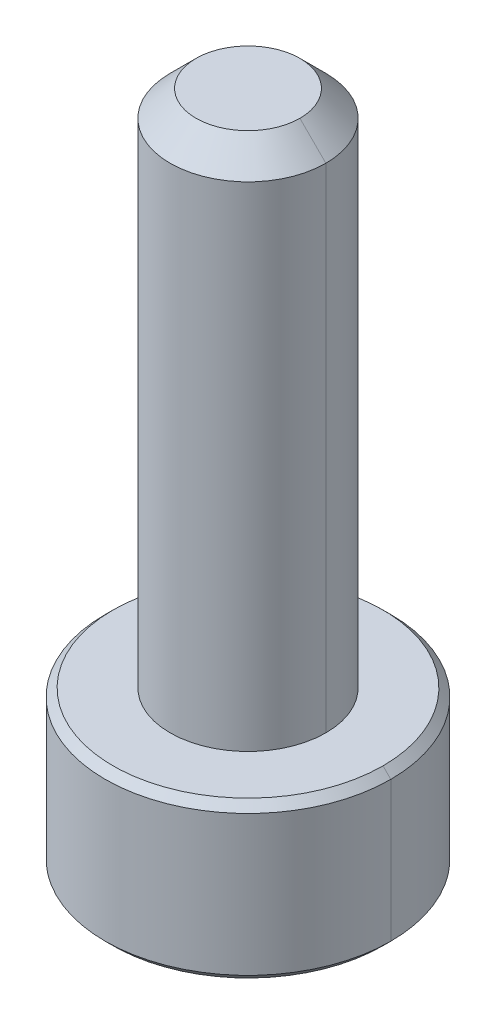
ISO-10303-21;
HEADER;
FILE_DESCRIPTION(('STEP AP214'),'2;1');
FILE_NAME('part.step','',(''),(''),'','','');
FILE_SCHEMA(('AUTOMOTIVE_DESIGN { 1 0 10303 214 1 1 1 1 }'));
ENDSEC;
DATA;
#1=APPLICATION_CONTEXT('core data for automotive mechanical design processes');
#2=APPLICATION_PROTOCOL_DEFINITION('international standard','automotive_design',2000,#1);
#3=PRODUCT_CONTEXT('',#1,'mechanical');
#4=PRODUCT('Part','Part','',(#3));
#5=PRODUCT_RELATED_PRODUCT_CATEGORY('part','',(#4));
#6=PRODUCT_DEFINITION_FORMATION('','',#4);
#7=PRODUCT_DEFINITION_CONTEXT('part definition',#1,'design');
#8=PRODUCT_DEFINITION('design','',#6,#7);
#9=PRODUCT_DEFINITION_SHAPE('','',#8);
#10=(LENGTH_UNIT() NAMED_UNIT(*) SI_UNIT(.MILLI.,.METRE.));
#11=(NAMED_UNIT(*) PLANE_ANGLE_UNIT() SI_UNIT($,.RADIAN.));
#12=(NAMED_UNIT(*) SI_UNIT($,.STERADIAN.) SOLID_ANGLE_UNIT());
#13=UNCERTAINTY_MEASURE_WITH_UNIT(LENGTH_MEASURE(1.E-05),#10,'distance_accuracy_value','');
#14=(GEOMETRIC_REPRESENTATION_CONTEXT(3) GLOBAL_UNCERTAINTY_ASSIGNED_CONTEXT((#13)) GLOBAL_UNIT_ASSIGNED_CONTEXT((#10,
#11,#12)) REPRESENTATION_CONTEXT('',''));
#15=CARTESIAN_POINT('',(0.,0.,0.));
#16=DIRECTION('',(0.,0.,1.));
#17=DIRECTION('',(1.,0.,0.));
#18=AXIS2_PLACEMENT_3D('',#15,#16,#17);
#19=CARTESIAN_POINT('',(-9.23760430703405,14.999999906,16.));
#20=DIRECTION('',(0.,-1.,0.));
#21=DIRECTION('',(1.,0.,0.));
#22=AXIS2_PLACEMENT_3D('',#19,#20,#21);
#23=CONICAL_SURFACE('',#22,1.,0.785398163397439);
#24=DIRECTION('',(-0.707106781186541,-0.707106781186554,0.));
#25=VECTOR('',#24,1.);
#26=CARTESIAN_POINT('',(-10.237604307034,14.999999906,16.));
#27=LINE('',#26,#25);
#28=CARTESIAN_POINT('',(-10.237604307034,14.999999906,16.));
#29=VERTEX_POINT('',#28);
#30=CARTESIAN_POINT('',(-10.737604307034,14.499999906,16.));
#31=VERTEX_POINT('',#30);
#32=EDGE_CURVE('E1132',#29,#31,#27,.T.);
#33=ORIENTED_EDGE('',*,*,#32,.F.);
#34=CARTESIAN_POINT('',(-9.23760430703405,14.999999906,16.));
#35=DIRECTION('',(0.,1.,0.));
#36=DIRECTION('',(-1.,0.,0.));
#37=AXIS2_PLACEMENT_3D('',#34,#35,#36);
#38=CIRCLE('',#37,1.);
#39=CARTESIAN_POINT('',(-8.23760430703405,14.999999906,16.));
#40=VERTEX_POINT('',#39);
#41=EDGE_CURVE('E276',#40,#29,#38,.T.);
#42=ORIENTED_EDGE('',*,*,#41,.F.);
#43=DIRECTION('',(0.707106781186541,-0.707106781186554,0.));
#44=VECTOR('',#43,1.);
#45=CARTESIAN_POINT('',(-8.23760430703405,14.999999906,16.));
#46=LINE('',#45,#44);
#47=CARTESIAN_POINT('',(-7.73760430703405,14.499999906,16.));
#48=VERTEX_POINT('',#47);
#49=EDGE_CURVE('E1120',#40,#48,#46,.T.);
#50=ORIENTED_EDGE('',*,*,#49,.T.);
#51=CARTESIAN_POINT('',(-9.23760430703405,14.499999906,16.));
#52=DIRECTION('',(0.,1.,0.));
#53=DIRECTION('',(-1.,0.,0.));
#54=AXIS2_PLACEMENT_3D('',#51,#52,#53);
#55=CIRCLE('',#54,1.5);
#56=EDGE_CURVE('E10',#48,#31,#55,.T.);
#57=ORIENTED_EDGE('',*,*,#56,.T.);
#58=EDGE_LOOP('',(#33,#42,#50,#57));
#59=FACE_BOUND('',#58,.T.);
#60=ADVANCED_FACE('F17',(#59),#23,.T.);
#61=CARTESIAN_POINT('',(-9.23760430703405,14.999999906,16.));
#62=DIRECTION('',(0.,1.,0.));
#63=DIRECTION('',(-1.,0.,0.));
#64=AXIS2_PLACEMENT_3D('',#61,#62,#63);
#65=CYLINDRICAL_SURFACE('',#64,1.5);
#66=DIRECTION('',(0.,1.,0.));
#67=VECTOR('',#66,1.);
#68=CARTESIAN_POINT('',(-7.73760430703405,14.999999906,16.));
#69=LINE('',#68,#67);
#70=CARTESIAN_POINT('',(-7.73760430703405,4.999999906,16.));
#71=VERTEX_POINT('',#70);
#72=EDGE_CURVE('E1077',#71,#48,#69,.T.);
#73=ORIENTED_EDGE('',*,*,#72,.F.);
#74=CARTESIAN_POINT('',(-9.23760430703405,4.999999906,16.));
#75=DIRECTION('',(0.,1.,0.));
#76=DIRECTION('',(-1.,0.,0.));
#77=AXIS2_PLACEMENT_3D('',#74,#75,#76);
#78=CIRCLE('',#77,1.5);
#79=CARTESIAN_POINT('',(-10.737604307034,4.999999906,16.));
#80=VERTEX_POINT('',#79);
#81=EDGE_CURVE('E333',#71,#80,#78,.T.);
#82=ORIENTED_EDGE('',*,*,#81,.T.);
#83=DIRECTION('',(0.,1.,0.));
#84=VECTOR('',#83,1.);
#85=CARTESIAN_POINT('',(-10.737604307034,14.999999906,16.));
#86=LINE('',#85,#84);
#87=EDGE_CURVE('E1069',#80,#31,#86,.T.);
#88=ORIENTED_EDGE('',*,*,#87,.T.);
#89=ORIENTED_EDGE('',*,*,#56,.F.);
#90=EDGE_LOOP('',(#73,#82,#88,#89));
#91=FACE_BOUND('',#90,.T.);
#92=ADVANCED_FACE('F19',(#91),#65,.T.);
#93=CARTESIAN_POINT('',(-9.23760430703405,4.999999906,16.));
#94=DIRECTION('',(0.,-1.,0.));
#95=DIRECTION('',(1.,0.,0.));
#96=AXIS2_PLACEMENT_3D('',#93,#94,#95);
#97=CONICAL_SURFACE('',#96,2.6,0.785398163397448);
#98=DIRECTION('',(-0.707106781186548,-0.707106781186548,0.));
#99=VECTOR('',#98,1.);
#100=CARTESIAN_POINT('',(-11.837604307034,4.999999906,16.));
#101=LINE('',#100,#99);
#102=CARTESIAN_POINT('',(-11.837604307034,4.999999906,16.));
#103=VERTEX_POINT('',#102);
#104=CARTESIAN_POINT('',(-11.987604307034,4.849999906,16.));
#105=VERTEX_POINT('',#104);
#106=EDGE_CURVE('E1058',#103,#105,#101,.T.);
#107=ORIENTED_EDGE('',*,*,#106,.F.);
#108=CARTESIAN_POINT('',(-9.23760430703405,4.999999906,16.));
#109=DIRECTION('',(0.,1.,0.));
#110=DIRECTION('',(-1.,0.,0.));
#111=AXIS2_PLACEMENT_3D('',#108,#109,#110);
#112=CIRCLE('',#111,2.6);
#113=CARTESIAN_POINT('',(-6.63760430703405,4.999999906,16.));
#114=VERTEX_POINT('',#113);
#115=EDGE_CURVE('E330',#114,#103,#112,.T.);
#116=ORIENTED_EDGE('',*,*,#115,.F.);
#117=DIRECTION('',(0.707106781186548,-0.707106781186548,0.));
#118=VECTOR('',#117,1.);
#119=CARTESIAN_POINT('',(-6.63760430703405,4.999999906,16.));
#120=LINE('',#119,#118);
#121=CARTESIAN_POINT('',(-6.48760430703405,4.849999906,16.));
#122=VERTEX_POINT('',#121);
#123=EDGE_CURVE('E1070',#114,#122,#120,.T.);
#124=ORIENTED_EDGE('',*,*,#123,.T.);
#125=CARTESIAN_POINT('',(-9.23760430703405,4.849999906,16.));
#126=DIRECTION('',(0.,1.,0.));
#127=DIRECTION('',(-1.,0.,0.));
#128=AXIS2_PLACEMENT_3D('',#125,#126,#127);
#129=CIRCLE('',#128,2.75);
#130=EDGE_CURVE('E26',#122,#105,#129,.T.);
#131=ORIENTED_EDGE('',*,*,#130,.T.);
#132=EDGE_LOOP('',(#107,#116,#124,#131));
#133=FACE_BOUND('',#132,.T.);
#134=ADVANCED_FACE('F419',(#133),#97,.T.);
#135=CARTESIAN_POINT('',(-9.23760430703405,14.999999906,16.));
#136=DIRECTION('',(0.,1.,0.));
#137=DIRECTION('',(-1.,0.,0.));
#138=AXIS2_PLACEMENT_3D('',#135,#136,#137);
#139=CYLINDRICAL_SURFACE('',#138,2.75);
#140=DIRECTION('',(0.,1.,0.));
#141=VECTOR('',#140,1.);
#142=CARTESIAN_POINT('',(-6.48760430703405,14.999999906,16.));
#143=LINE('',#142,#141);
#144=CARTESIAN_POINT('',(-6.48760430703405,2.149999906,16.));
#145=VERTEX_POINT('',#144);
#146=EDGE_CURVE('E1083',#145,#122,#143,.T.);
#147=ORIENTED_EDGE('',*,*,#146,.F.);
#148=CARTESIAN_POINT('',(-9.23760430703405,2.149999906,16.));
#149=DIRECTION('',(0.,1.,0.));
#150=DIRECTION('',(-1.,0.,0.));
#151=AXIS2_PLACEMENT_3D('',#148,#149,#150);
#152=CIRCLE('',#151,2.75);
#153=CARTESIAN_POINT('',(-11.987604307034,2.149999906,16.));
#154=VERTEX_POINT('',#153);
#155=EDGE_CURVE('E340',#145,#154,#152,.T.);
#156=ORIENTED_EDGE('',*,*,#155,.T.);
#157=DIRECTION('',(0.,1.,0.));
#158=VECTOR('',#157,1.);
#159=CARTESIAN_POINT('',(-11.987604307034,14.999999906,16.));
#160=LINE('',#159,#158);
#161=EDGE_CURVE('E1091',#154,#105,#160,.T.);
#162=ORIENTED_EDGE('',*,*,#161,.T.);
#163=ORIENTED_EDGE('',*,*,#130,.F.);
#164=EDGE_LOOP('',(#147,#156,#162,#163));
#165=FACE_BOUND('',#164,.T.);
#166=ADVANCED_FACE('F744',(#165),#139,.T.);
#167=CARTESIAN_POINT('',(-9.23760430703405,2.149999906,16.));
#168=DIRECTION('',(0.,1.,0.));
#169=DIRECTION('',(-1.,0.,0.));
#170=AXIS2_PLACEMENT_3D('',#167,#168,#169);
#171=CONICAL_SURFACE('',#170,2.75,0.785398163397447);
#172=DIRECTION('',(0.707106781186547,0.707106781186549,0.));
#173=VECTOR('',#172,1.);
#174=CARTESIAN_POINT('',(-6.48760430703405,2.149999906,16.));
#175=LINE('',#174,#173);
#176=CARTESIAN_POINT('',(-6.63760430703405,1.999999906,16.));
#177=VERTEX_POINT('',#176);
#178=EDGE_CURVE('E186',#177,#145,#175,.T.);
#179=ORIENTED_EDGE('',*,*,#178,.F.);
#180=CARTESIAN_POINT('',(-9.23760430703405,1.999999906,16.));
#181=DIRECTION('',(0.,1.,0.));
#182=DIRECTION('',(-1.,0.,0.));
#183=AXIS2_PLACEMENT_3D('',#180,#181,#182);
#184=CIRCLE('',#183,2.6);
#185=CARTESIAN_POINT('',(-11.837604307034,1.999999906,16.));
#186=VERTEX_POINT('',#185);
#187=EDGE_CURVE('E335',#177,#186,#184,.T.);
#188=ORIENTED_EDGE('',*,*,#187,.T.);
#189=DIRECTION('',(-0.707106781186547,0.707106781186549,0.));
#190=VECTOR('',#189,1.);
#191=CARTESIAN_POINT('',(-11.987604307034,2.149999906,16.));
#192=LINE('',#191,#190);
#193=EDGE_CURVE('E181',#186,#154,#192,.T.);
#194=ORIENTED_EDGE('',*,*,#193,.T.);
#195=ORIENTED_EDGE('',*,*,#155,.F.);
#196=EDGE_LOOP('',(#179,#188,#194,#195));
#197=FACE_BOUND('',#196,.T.);
#198=ADVANCED_FACE('F737',(#197),#171,.T.);
#199=CARTESIAN_POINT('',(-9.23760430703405,1.999999906,18.6));
#200=DIRECTION('',(0.,-1.,0.));
#201=DIRECTION('',(0.,0.,-1.));
#202=AXIS2_PLACEMENT_3D('',#199,#200,#201);
#203=PLANE('',#202);
#204=CARTESIAN_POINT('',(-9.23760430703405,1.999999906,16.));
#205=DIRECTION('',(0.,-1.,0.));
#206=DIRECTION('',(1.,0.,0.));
#207=AXIS2_PLACEMENT_3D('',#204,#205,#206);
#208=CIRCLE('',#207,1.44337567297406);
#209=CARTESIAN_POINT('',(-7.79422863405999,1.999999906,16.));
#210=VERTEX_POINT('',#209);
#211=CARTESIAN_POINT('',(-8.51591647054702,1.999999906,17.25));
#212=VERTEX_POINT('',#211);
#213=EDGE_CURVE('E285',#210,#212,#208,.T.);
#214=ORIENTED_EDGE('',*,*,#213,.F.);
#215=CARTESIAN_POINT('',(-9.23760430703405,1.999999906,16.));
#216=DIRECTION('',(0.,-1.,0.));
#217=DIRECTION('',(1.,0.,0.));
#218=AXIS2_PLACEMENT_3D('',#215,#216,#217);
#219=CIRCLE('',#218,1.44337567297406);
#220=CARTESIAN_POINT('',(-8.51591647054702,1.999999906,14.75));
#221=VERTEX_POINT('',#220);
#222=EDGE_CURVE('E286',#221,#210,#219,.T.);
#223=ORIENTED_EDGE('',*,*,#222,.F.);
#224=CARTESIAN_POINT('',(-9.23760430703405,1.999999906,16.));
#225=DIRECTION('',(0.,-1.,0.));
#226=DIRECTION('',(1.,0.,0.));
#227=AXIS2_PLACEMENT_3D('',#224,#225,#226);
#228=CIRCLE('',#227,1.44337567297406);
#229=CARTESIAN_POINT('',(-9.95929214352108,1.999999906,14.75));
#230=VERTEX_POINT('',#229);
#231=EDGE_CURVE('E388',#230,#221,#228,.T.);
#232=ORIENTED_EDGE('',*,*,#231,.F.);
#233=CARTESIAN_POINT('',(-9.23760430703405,1.999999906,16.));
#234=DIRECTION('',(0.,-1.,0.));
#235=DIRECTION('',(1.,0.,0.));
#236=AXIS2_PLACEMENT_3D('',#233,#234,#235);
#237=CIRCLE('',#236,1.44337567297406);
#238=CARTESIAN_POINT('',(-10.6809799800081,1.999999906,16.));
#239=VERTEX_POINT('',#238);
#240=EDGE_CURVE('E243',#239,#230,#237,.T.);
#241=ORIENTED_EDGE('',*,*,#240,.F.);
#242=CARTESIAN_POINT('',(-9.23760430703405,1.999999906,16.));
#243=DIRECTION('',(0.,-1.,0.));
#244=DIRECTION('',(1.,0.,0.));
#245=AXIS2_PLACEMENT_3D('',#242,#243,#244);
#246=CIRCLE('',#245,1.44337567297406);
#247=CARTESIAN_POINT('',(-9.95929214352108,1.999999906,17.25));
#248=VERTEX_POINT('',#247);
#249=EDGE_CURVE('E279',#248,#239,#246,.T.);
#250=ORIENTED_EDGE('',*,*,#249,.F.);
#251=CARTESIAN_POINT('',(-9.23760430703405,1.999999906,16.));
#252=DIRECTION('',(0.,-1.,0.));
#253=DIRECTION('',(1.,0.,0.));
#254=AXIS2_PLACEMENT_3D('',#251,#252,#253);
#255=CIRCLE('',#254,1.44337567297406);
#256=EDGE_CURVE('E45',#212,#248,#255,.T.);
#257=ORIENTED_EDGE('',*,*,#256,.F.);
#258=EDGE_LOOP('',(#214,#223,#232,#241,#250,#257));
#259=FACE_BOUND('',#258,.T.);
#260=CARTESIAN_POINT('',(-9.23760430703405,1.999999906,16.));
#261=DIRECTION('',(0.,1.,0.));
#262=DIRECTION('',(-1.,0.,0.));
#263=AXIS2_PLACEMENT_3D('',#260,#261,#262);
#264=CIRCLE('',#263,2.6);
#265=EDGE_CURVE('E1094',#186,#177,#264,.T.);
#266=ORIENTED_EDGE('',*,*,#265,.F.);
#267=ORIENTED_EDGE('',*,*,#187,.F.);
#268=EDGE_LOOP('',(#266,#267));
#269=FACE_BOUND('',#268,.T.);
#270=ADVANCED_FACE('F729',(#259,#269),#203,.T.);
#271=CARTESIAN_POINT('',(-9.23760430703405,4.999999906,18.6));
#272=DIRECTION('',(0.,1.,0.));
#273=DIRECTION('',(1.,0.,0.));
#274=AXIS2_PLACEMENT_3D('',#271,#272,#273);
#275=PLANE('',#274);
#276=CARTESIAN_POINT('',(-9.23760430703405,4.999999906,16.));
#277=DIRECTION('',(0.,1.,0.));
#278=DIRECTION('',(-1.,0.,0.));
#279=AXIS2_PLACEMENT_3D('',#276,#277,#278);
#280=CIRCLE('',#279,1.5);
#281=EDGE_CURVE('E1115',#80,#71,#280,.T.);
#282=ORIENTED_EDGE('',*,*,#281,.F.);
#283=ORIENTED_EDGE('',*,*,#81,.F.);
#284=EDGE_LOOP('',(#282,#283));
#285=FACE_BOUND('',#284,.T.);
#286=ORIENTED_EDGE('',*,*,#115,.T.);
#287=CARTESIAN_POINT('',(-9.23760430703405,4.999999906,16.));
#288=DIRECTION('',(0.,1.,0.));
#289=DIRECTION('',(-1.,0.,0.));
#290=AXIS2_PLACEMENT_3D('',#287,#288,#289);
#291=CIRCLE('',#290,2.6);
#292=EDGE_CURVE('E1062',#103,#114,#291,.T.);
#293=ORIENTED_EDGE('',*,*,#292,.T.);
#294=EDGE_LOOP('',(#286,#293));
#295=FACE_BOUND('',#294,.T.);
#296=ADVANCED_FACE('F718',(#285,#295),#275,.T.);
#297=CARTESIAN_POINT('',(-9.23760430703405,14.999999906,17.));
#298=DIRECTION('',(0.,1.,0.));
#299=DIRECTION('',(1.,0.,0.));
#300=AXIS2_PLACEMENT_3D('',#297,#298,#299);
#301=PLANE('',#300);
#302=ORIENTED_EDGE('',*,*,#41,.T.);
#303=CARTESIAN_POINT('',(-9.23760430703405,14.999999906,16.));
#304=DIRECTION('',(0.,1.,0.));
#305=DIRECTION('',(-1.,0.,0.));
#306=AXIS2_PLACEMENT_3D('',#303,#304,#305);
#307=CIRCLE('',#306,1.);
#308=EDGE_CURVE('E1139',#29,#40,#307,.T.);
#309=ORIENTED_EDGE('',*,*,#308,.T.);
#310=EDGE_LOOP('',(#302,#309));
#311=FACE_BOUND('',#310,.T.);
#312=ADVANCED_FACE('F262',(#311),#301,.T.);
#313=CARTESIAN_POINT('',(-9.23760430703405,1.999999906,16.));
#314=DIRECTION('',(0.,-1.,0.));
#315=DIRECTION('',(1.,0.,0.));
#316=AXIS2_PLACEMENT_3D('',#313,#314,#315);
#317=CONICAL_SURFACE('',#316,1.44337567297406,0.78539816339745);
#318=ORIENTED_EDGE('',*,*,#256,.T.);
#319=CARTESIAN_POINT('',(-8.51591647054702,1.999999906,17.25));
#320=CARTESIAN_POINT('',(-8.90094048710066,2.19251191427682,17.25));
#321=CARTESIAN_POINT('',(-9.2349479094966,2.19337275639813,17.25));
#322=CARTESIAN_POINT('',(-9.57081517169855,2.19423839191126,17.25));
#323=CARTESIAN_POINT('',(-9.95929214352108,1.999999906,17.25));
#324=B_SPLINE_CURVE_WITH_KNOTS('',2,(#319,#320,#321,#322,#323),.UNSPECIFIED.,.F.,.F.,(3,2,3),
(0.,0.5,1.),.UNSPECIFIED.);
#325=EDGE_CURVE('E322',#212,#248,#324,.T.);
#326=ORIENTED_EDGE('',*,*,#325,.F.);
#327=EDGE_LOOP('',(#318,#326));
#328=FACE_BOUND('',#327,.T.);
#329=ADVANCED_FACE('F260',(#328),#317,.F.);
#330=CARTESIAN_POINT('',(-9.23760430703405,1.999999906,16.));
#331=DIRECTION('',(0.,-1.,0.));
#332=DIRECTION('',(1.,0.,0.));
#333=AXIS2_PLACEMENT_3D('',#330,#331,#332);
#334=CONICAL_SURFACE('',#333,1.44337567297406,0.78539816339745);
#335=ORIENTED_EDGE('',*,*,#249,.T.);
#336=CARTESIAN_POINT('',(-9.95929214352108,1.999999906,17.25));
#337=CARTESIAN_POINT('',(-10.1518041517982,2.19251191427708,16.916559420597));
#338=CARTESIAN_POINT('',(-10.3188078629959,2.19337275639813,16.62730050775));
#339=CARTESIAN_POINT('',(-10.4867414940971,2.194238391911,16.3364309263831));
#340=CARTESIAN_POINT('',(-10.6809799800081,1.999999906,16.));
#341=B_SPLINE_CURVE_WITH_KNOTS('',2,(#336,#337,#338,#339,#340),.UNSPECIFIED.,.F.,.F.,(3,2,3),
(0.,0.5,1.),.UNSPECIFIED.);
#342=EDGE_CURVE('E239',#248,#239,#341,.T.);
#343=ORIENTED_EDGE('',*,*,#342,.F.);
#344=EDGE_LOOP('',(#335,#343));
#345=FACE_BOUND('',#344,.T.);
#346=ADVANCED_FACE('F247',(#345),#334,.F.);
#347=CARTESIAN_POINT('',(-9.23760430703405,1.999999906,16.));
#348=DIRECTION('',(0.,-1.,0.));
#349=DIRECTION('',(1.,0.,0.));
#350=AXIS2_PLACEMENT_3D('',#347,#348,#349);
#351=CONICAL_SURFACE('',#350,1.44337567297406,0.78539816339745);
#352=ORIENTED_EDGE('',*,*,#240,.T.);
#353=CARTESIAN_POINT('',(-10.6809799800081,1.999999906,16.));
#354=CARTESIAN_POINT('',(-10.4884679717316,2.19251191427654,15.6665594205979));
#355=CARTESIAN_POINT('',(-10.3214642605333,2.19337275639813,15.37730050775));
#356=CARTESIAN_POINT('',(-10.1535306294326,2.19423839191153,15.086430926384));
#357=CARTESIAN_POINT('',(-9.95929214352109,1.999999906,14.75));
#358=B_SPLINE_CURVE_WITH_KNOTS('',2,(#353,#354,#355,#356,#357),.UNSPECIFIED.,.F.,.F.,(3,2,3),
(0.,0.5,1.),.UNSPECIFIED.);
#359=EDGE_CURVE('E309',#239,#230,#358,.T.);
#360=ORIENTED_EDGE('',*,*,#359,.F.);
#361=EDGE_LOOP('',(#352,#360));
#362=FACE_BOUND('',#361,.T.);
#363=ADVANCED_FACE('F257',(#362),#351,.F.);
#364=CARTESIAN_POINT('',(-9.23760430703405,1.999999906,16.));
#365=DIRECTION('',(0.,-1.,0.));
#366=DIRECTION('',(1.,0.,0.));
#367=AXIS2_PLACEMENT_3D('',#364,#365,#366);
#368=CONICAL_SURFACE('',#367,1.44337567297406,0.78539816339745);
#369=ORIENTED_EDGE('',*,*,#231,.T.);
#370=CARTESIAN_POINT('',(-9.95929214352108,1.999999906,14.75));
#371=CARTESIAN_POINT('',(-9.57426812696743,2.19251191427682,14.75));
#372=CARTESIAN_POINT('',(-9.2402607045715,2.19337275639813,14.75));
#373=CARTESIAN_POINT('',(-8.90439344236954,2.19423839191126,14.75));
#374=CARTESIAN_POINT('',(-8.51591647054702,1.999999906,14.75));
#375=B_SPLINE_CURVE_WITH_KNOTS('',2,(#370,#371,#372,#373,#374),.UNSPECIFIED.,.F.,.F.,(3,2,3),
(0.,0.5,1.),.UNSPECIFIED.);
#376=EDGE_CURVE('E379',#230,#221,#375,.T.);
#377=ORIENTED_EDGE('',*,*,#376,.F.);
#378=EDGE_LOOP('',(#369,#377));
#379=FACE_BOUND('',#378,.T.);
#380=ADVANCED_FACE('F259',(#379),#368,.F.);
#381=CARTESIAN_POINT('',(-9.23760430703405,1.999999906,16.));
#382=DIRECTION('',(0.,-1.,0.));
#383=DIRECTION('',(1.,0.,0.));
#384=AXIS2_PLACEMENT_3D('',#381,#382,#383);
#385=CONICAL_SURFACE('',#384,1.44337567297406,0.78539816339745);
#386=ORIENTED_EDGE('',*,*,#222,.T.);
#387=CARTESIAN_POINT('',(-8.51591647054702,1.999999906,14.75));
#388=CARTESIAN_POINT('',(-8.32340446226992,2.1925119142771,15.0834405794031));
#389=CARTESIAN_POINT('',(-8.15640075107223,2.19337275639813,15.37269949225));
#390=CARTESIAN_POINT('',(-7.98846711997098,2.19423839191099,15.6635690736169));
#391=CARTESIAN_POINT('',(-7.79422863405999,1.999999906,16.));
#392=B_SPLINE_CURVE_WITH_KNOTS('',2,(#387,#388,#389,#390,#391),.UNSPECIFIED.,.F.,.F.,(3,2,3),
(0.,0.5,1.),.UNSPECIFIED.);
#393=EDGE_CURVE('E165',#221,#210,#392,.T.);
#394=ORIENTED_EDGE('',*,*,#393,.F.);
#395=EDGE_LOOP('',(#386,#394));
#396=FACE_BOUND('',#395,.T.);
#397=ADVANCED_FACE('F217',(#396),#385,.F.);
#398=CARTESIAN_POINT('',(-9.23760430703405,1.999999906,16.));
#399=DIRECTION('',(0.,-1.,0.));
#400=DIRECTION('',(1.,0.,0.));
#401=AXIS2_PLACEMENT_3D('',#398,#399,#400);
#402=CONICAL_SURFACE('',#401,1.44337567297406,0.78539816339745);
#403=ORIENTED_EDGE('',*,*,#213,.T.);
#404=CARTESIAN_POINT('',(-7.79422863405999,1.999999906,16.));
#405=CARTESIAN_POINT('',(-7.98674064233709,2.1925119142771,16.333440579403));
#406=CARTESIAN_POINT('',(-8.15374435353478,2.19337275639814,16.62269949225));
#407=CARTESIAN_POINT('',(-8.32167798463604,2.19423839191099,16.9135690736169));
#408=CARTESIAN_POINT('',(-8.51591647054702,1.999999906,17.25));
#409=B_SPLINE_CURVE_WITH_KNOTS('',2,(#404,#405,#406,#407,#408),.UNSPECIFIED.,.F.,.F.,(3,2,3),
(0.,0.5,1.),.UNSPECIFIED.);
#410=EDGE_CURVE('E178',#210,#212,#409,.T.);
#411=ORIENTED_EDGE('',*,*,#410,.F.);
#412=EDGE_LOOP('',(#403,#411));
#413=FACE_BOUND('',#412,.T.);
#414=ADVANCED_FACE('F361',(#413),#402,.F.);
#415=CARTESIAN_POINT('',(-9.23760430703405,3.499999906,18.6));
#416=DIRECTION('',(0.,-1.,0.));
#417=DIRECTION('',(0.,0.,-1.));
#418=AXIS2_PLACEMENT_3D('',#415,#416,#417);
#419=PLANE('',#418);
#420=DIRECTION('',(0.5,0.,-0.866025403784439));
#421=VECTOR('',#420,1.);
#422=CARTESIAN_POINT('',(-7.79422863405999,3.499999906,16.));
#423=LINE('',#422,#421);
#424=CARTESIAN_POINT('',(-8.51591647054702,3.499999906,17.25));
#425=VERTEX_POINT('',#424);
#426=CARTESIAN_POINT('',(-7.79422863405999,3.499999906,16.));
#427=VERTEX_POINT('',#426);
#428=EDGE_CURVE('E152',#425,#427,#423,.T.);
#429=ORIENTED_EDGE('',*,*,#428,.F.);
#430=DIRECTION('',(1.,0.,0.));
#431=VECTOR('',#430,1.);
#432=CARTESIAN_POINT('',(-8.51591647054702,3.499999906,17.25));
#433=LINE('',#432,#431);
#434=CARTESIAN_POINT('',(-9.95929214352108,3.499999906,17.25));
#435=VERTEX_POINT('',#434);
#436=EDGE_CURVE('E52',#435,#425,#433,.T.);
#437=ORIENTED_EDGE('',*,*,#436,.F.);
#438=DIRECTION('',(0.5,0.,0.866025403784439));
#439=VECTOR('',#438,1.);
#440=CARTESIAN_POINT('',(-9.95929214352108,3.499999906,17.25));
#441=LINE('',#440,#439);
#442=CARTESIAN_POINT('',(-10.6809799800081,3.499999906,16.));
#443=VERTEX_POINT('',#442);
#444=EDGE_CURVE('E307',#443,#435,#441,.T.);
#445=ORIENTED_EDGE('',*,*,#444,.F.);
#446=DIRECTION('',(-0.5,0.,0.866025403784439));
#447=VECTOR('',#446,1.);
#448=CARTESIAN_POINT('',(-10.6809799800081,3.499999906,16.));
#449=LINE('',#448,#447);
#450=CARTESIAN_POINT('',(-9.95929214352108,3.499999906,14.75));
#451=VERTEX_POINT('',#450);
#452=EDGE_CURVE('E296',#451,#443,#449,.T.);
#453=ORIENTED_EDGE('',*,*,#452,.F.);
#454=DIRECTION('',(-1.,0.,0.));
#455=VECTOR('',#454,1.);
#456=CARTESIAN_POINT('',(-9.95929214352108,3.499999906,14.75));
#457=LINE('',#456,#455);
#458=CARTESIAN_POINT('',(-8.51591647054702,3.499999906,14.75));
#459=VERTEX_POINT('',#458);
#460=EDGE_CURVE('E154',#459,#451,#457,.T.);
#461=ORIENTED_EDGE('',*,*,#460,.F.);
#462=DIRECTION('',(-0.5,0.,-0.866025403784439));
#463=VECTOR('',#462,1.);
#464=CARTESIAN_POINT('',(-8.51591647054702,3.499999906,14.75));
#465=LINE('',#464,#463);
#466=EDGE_CURVE('E146',#427,#459,#465,.T.);
#467=ORIENTED_EDGE('',*,*,#466,.F.);
#468=EDGE_LOOP('',(#429,#437,#445,#453,#461,#467));
#469=FACE_BOUND('',#468,.T.);
#470=ADVANCED_FACE('F153',(#469),#419,.T.);
#471=CARTESIAN_POINT('',(-8.51591647054702,8.81881298512987,17.25));
#472=DIRECTION('',(0.,0.,1.));
#473=DIRECTION('',(1.,0.,0.));
#474=AXIS2_PLACEMENT_3D('',#471,#472,#473);
#475=PLANE('',#474);
#476=DIRECTION('',(0.,-1.,0.));
#477=VECTOR('',#476,1.);
#478=CARTESIAN_POINT('',(-8.51591647054702,8.81881298512987,17.25));
#479=LINE('',#478,#477);
#480=EDGE_CURVE('E169',#425,#212,#479,.T.);
#481=ORIENTED_EDGE('',*,*,#480,.T.);
#482=ORIENTED_EDGE('',*,*,#325,.T.);
#483=DIRECTION('',(0.,-1.,0.));
#484=VECTOR('',#483,1.);
#485=CARTESIAN_POINT('',(-9.95929214352108,8.81881298512987,17.25));
#486=LINE('',#485,#484);
#487=EDGE_CURVE('E300',#435,#248,#486,.T.);
#488=ORIENTED_EDGE('',*,*,#487,.F.);
#489=ORIENTED_EDGE('',*,*,#436,.T.);
#490=EDGE_LOOP('',(#481,#482,#488,#489));
#491=FACE_BOUND('',#490,.T.);
#492=ADVANCED_FACE('F216',(#491),#475,.F.);
#493=CARTESIAN_POINT('',(-9.95929214352108,8.81881298512987,17.25));
#494=DIRECTION('',(-0.866025403784439,0.,0.5));
#495=DIRECTION('',(0.,1.,0.));
#496=AXIS2_PLACEMENT_3D('',#493,#494,#495);
#497=PLANE('',#496);
#498=ORIENTED_EDGE('',*,*,#487,.T.);
#499=ORIENTED_EDGE('',*,*,#342,.T.);
#500=DIRECTION('',(0.,-1.,0.));
#501=VECTOR('',#500,1.);
#502=CARTESIAN_POINT('',(-10.6809799800081,8.81881298512987,16.));
#503=LINE('',#502,#501);
#504=EDGE_CURVE('E319',#443,#239,#503,.T.);
#505=ORIENTED_EDGE('',*,*,#504,.F.);
#506=ORIENTED_EDGE('',*,*,#444,.T.);
#507=EDGE_LOOP('',(#498,#499,#505,#506));
#508=FACE_BOUND('',#507,.T.);
#509=ADVANCED_FACE('F215',(#508),#497,.F.);
#510=CARTESIAN_POINT('',(-10.6809799800081,8.81881298512987,16.));
#511=DIRECTION('',(-0.866025403784439,0.,-0.5));
#512=DIRECTION('',(-0.5,0.,0.866025403784439));
#513=AXIS2_PLACEMENT_3D('',#510,#511,#512);
#514=PLANE('',#513);
#515=ORIENTED_EDGE('',*,*,#504,.T.);
#516=ORIENTED_EDGE('',*,*,#359,.T.);
#517=DIRECTION('',(0.,-1.,0.));
#518=VECTOR('',#517,1.);
#519=CARTESIAN_POINT('',(-9.95929214352108,8.81881298512987,14.75));
#520=LINE('',#519,#518);
#521=EDGE_CURVE('E161',#451,#230,#520,.T.);
#522=ORIENTED_EDGE('',*,*,#521,.F.);
#523=ORIENTED_EDGE('',*,*,#452,.T.);
#524=EDGE_LOOP('',(#515,#516,#522,#523));
#525=FACE_BOUND('',#524,.T.);
#526=ADVANCED_FACE('F220',(#525),#514,.F.);
#527=CARTESIAN_POINT('',(-9.95929214352108,8.81881298512987,14.75));
#528=DIRECTION('',(0.,0.,-1.));
#529=DIRECTION('',(-1.,0.,0.));
#530=AXIS2_PLACEMENT_3D('',#527,#528,#529);
#531=PLANE('',#530);
#532=ORIENTED_EDGE('',*,*,#521,.T.);
#533=ORIENTED_EDGE('',*,*,#376,.T.);
#534=DIRECTION('',(0.,-1.,0.));
#535=VECTOR('',#534,1.);
#536=CARTESIAN_POINT('',(-8.51591647054702,8.81881298512987,14.75));
#537=LINE('',#536,#535);
#538=EDGE_CURVE('E175',#459,#221,#537,.T.);
#539=ORIENTED_EDGE('',*,*,#538,.F.);
#540=ORIENTED_EDGE('',*,*,#460,.T.);
#541=EDGE_LOOP('',(#532,#533,#539,#540));
#542=FACE_BOUND('',#541,.T.);
#543=ADVANCED_FACE('F360',(#542),#531,.F.);
#544=CARTESIAN_POINT('',(-8.51591647054702,8.81881298512987,14.75));
#545=DIRECTION('',(0.866025403784439,0.,-0.5));
#546=DIRECTION('',(0.,-1.,0.));
#547=AXIS2_PLACEMENT_3D('',#544,#545,#546);
#548=PLANE('',#547);
#549=ORIENTED_EDGE('',*,*,#538,.T.);
#550=ORIENTED_EDGE('',*,*,#393,.T.);
#551=DIRECTION('',(0.,-1.,0.));
#552=VECTOR('',#551,1.);
#553=CARTESIAN_POINT('',(-7.79422863405999,8.81881298512987,16.));
#554=LINE('',#553,#552);
#555=EDGE_CURVE('E168',#427,#210,#554,.T.);
#556=ORIENTED_EDGE('',*,*,#555,.F.);
#557=ORIENTED_EDGE('',*,*,#466,.T.);
#558=EDGE_LOOP('',(#549,#550,#556,#557));
#559=FACE_BOUND('',#558,.T.);
#560=ADVANCED_FACE('F174',(#559),#548,.F.);
#561=CARTESIAN_POINT('',(-7.79422863405999,8.81881298512987,16.));
#562=DIRECTION('',(0.866025403784439,0.,0.5));
#563=DIRECTION('',(0.,-1.,0.));
#564=AXIS2_PLACEMENT_3D('',#561,#562,#563);
#565=PLANE('',#564);
#566=ORIENTED_EDGE('',*,*,#555,.T.);
#567=ORIENTED_EDGE('',*,*,#410,.T.);
#568=ORIENTED_EDGE('',*,*,#480,.F.);
#569=ORIENTED_EDGE('',*,*,#428,.T.);
#570=EDGE_LOOP('',(#566,#567,#568,#569));
#571=FACE_BOUND('',#570,.T.);
#572=ADVANCED_FACE('F166',(#571),#565,.F.);
#573=CARTESIAN_POINT('',(-9.23760430703405,2.149999906,16.));
#574=DIRECTION('',(0.,1.,0.));
#575=DIRECTION('',(-1.,0.,0.));
#576=AXIS2_PLACEMENT_3D('',#573,#574,#575);
#577=CONICAL_SURFACE('',#576,2.75,0.785398163397447);
#578=ORIENTED_EDGE('',*,*,#265,.T.);
#579=ORIENTED_EDGE('',*,*,#178,.T.);
#580=CARTESIAN_POINT('',(-9.23760430703405,2.149999906,16.));
#581=DIRECTION('',(0.,1.,0.));
#582=DIRECTION('',(-1.,0.,0.));
#583=AXIS2_PLACEMENT_3D('',#580,#581,#582);
#584=CIRCLE('',#583,2.75);
#585=EDGE_CURVE('E1078',#154,#145,#584,.T.);
#586=ORIENTED_EDGE('',*,*,#585,.F.);
#587=ORIENTED_EDGE('',*,*,#193,.F.);
#588=EDGE_LOOP('',(#578,#579,#586,#587));
#589=FACE_BOUND('',#588,.T.);
#590=ADVANCED_FACE('F212',(#589),#577,.T.);
#591=CARTESIAN_POINT('',(-9.23760430703405,14.999999906,16.));
#592=DIRECTION('',(0.,1.,0.));
#593=DIRECTION('',(-1.,0.,0.));
#594=AXIS2_PLACEMENT_3D('',#591,#592,#593);
#595=CYLINDRICAL_SURFACE('',#594,2.75);
#596=ORIENTED_EDGE('',*,*,#585,.T.);
#597=ORIENTED_EDGE('',*,*,#146,.T.);
#598=CARTESIAN_POINT('',(-9.23760430703405,4.849999906,16.));
#599=DIRECTION('',(0.,1.,0.));
#600=DIRECTION('',(-1.,0.,0.));
#601=AXIS2_PLACEMENT_3D('',#598,#599,#600);
#602=CIRCLE('',#601,2.75);
#603=EDGE_CURVE('E1063',#105,#122,#602,.T.);
#604=ORIENTED_EDGE('',*,*,#603,.F.);
#605=ORIENTED_EDGE('',*,*,#161,.F.);
#606=EDGE_LOOP('',(#596,#597,#604,#605));
#607=FACE_BOUND('',#606,.T.);
#608=ADVANCED_FACE('F624',(#607),#595,.T.);
#609=CARTESIAN_POINT('',(-9.23760430703405,4.999999906,16.));
#610=DIRECTION('',(0.,-1.,0.));
#611=DIRECTION('',(1.,0.,0.));
#612=AXIS2_PLACEMENT_3D('',#609,#610,#611);
#613=CONICAL_SURFACE('',#612,2.6,0.785398163397448);
#614=ORIENTED_EDGE('',*,*,#292,.F.);
#615=ORIENTED_EDGE('',*,*,#106,.T.);
#616=ORIENTED_EDGE('',*,*,#603,.T.);
#617=ORIENTED_EDGE('',*,*,#123,.F.);
#618=EDGE_LOOP('',(#614,#615,#616,#617));
#619=FACE_BOUND('',#618,.T.);
#620=ADVANCED_FACE('F620',(#619),#613,.T.);
#621=CARTESIAN_POINT('',(-9.23760430703405,14.999999906,16.));
#622=DIRECTION('',(0.,1.,0.));
#623=DIRECTION('',(-1.,0.,0.));
#624=AXIS2_PLACEMENT_3D('',#621,#622,#623);
#625=CYLINDRICAL_SURFACE('',#624,1.5);
#626=ORIENTED_EDGE('',*,*,#281,.T.);
#627=ORIENTED_EDGE('',*,*,#72,.T.);
#628=CARTESIAN_POINT('',(-9.23760430703405,14.499999906,16.));
#629=DIRECTION('',(0.,1.,0.));
#630=DIRECTION('',(-1.,0.,0.));
#631=AXIS2_PLACEMENT_3D('',#628,#629,#630);
#632=CIRCLE('',#631,1.5);
#633=EDGE_CURVE('E1112',#31,#48,#632,.T.);
#634=ORIENTED_EDGE('',*,*,#633,.F.);
#635=ORIENTED_EDGE('',*,*,#87,.F.);
#636=EDGE_LOOP('',(#626,#627,#634,#635));
#637=FACE_BOUND('',#636,.T.);
#638=ADVANCED_FACE('F606',(#637),#625,.T.);
#639=CARTESIAN_POINT('',(-9.23760430703405,14.999999906,16.));
#640=DIRECTION('',(0.,-1.,0.));
#641=DIRECTION('',(1.,0.,0.));
#642=AXIS2_PLACEMENT_3D('',#639,#640,#641);
#643=CONICAL_SURFACE('',#642,1.,0.785398163397439);
#644=ORIENTED_EDGE('',*,*,#308,.F.);
#645=ORIENTED_EDGE('',*,*,#32,.T.);
#646=ORIENTED_EDGE('',*,*,#633,.T.);
#647=ORIENTED_EDGE('',*,*,#49,.F.);
#648=EDGE_LOOP('',(#644,#645,#646,#647));
#649=FACE_BOUND('',#648,.T.);
#650=ADVANCED_FACE('F425',(#649),#643,.T.);
#651=CLOSED_SHELL('',(#60,#92,#134,#166,#198,#270,#296,#312,#329,#346,#363,#380,#397,#414,#470,
#492,#509,#526,#543,#560,#572,#590,#608,#620,#638,#650));
#652=MANIFOLD_SOLID_BREP('B1',#651);
#653=ADVANCED_BREP_SHAPE_REPRESENTATION('',(#18,#652),#14);
#654=SHAPE_DEFINITION_REPRESENTATION(#9,#653);
ENDSEC;
END-ISO-10303-21;
